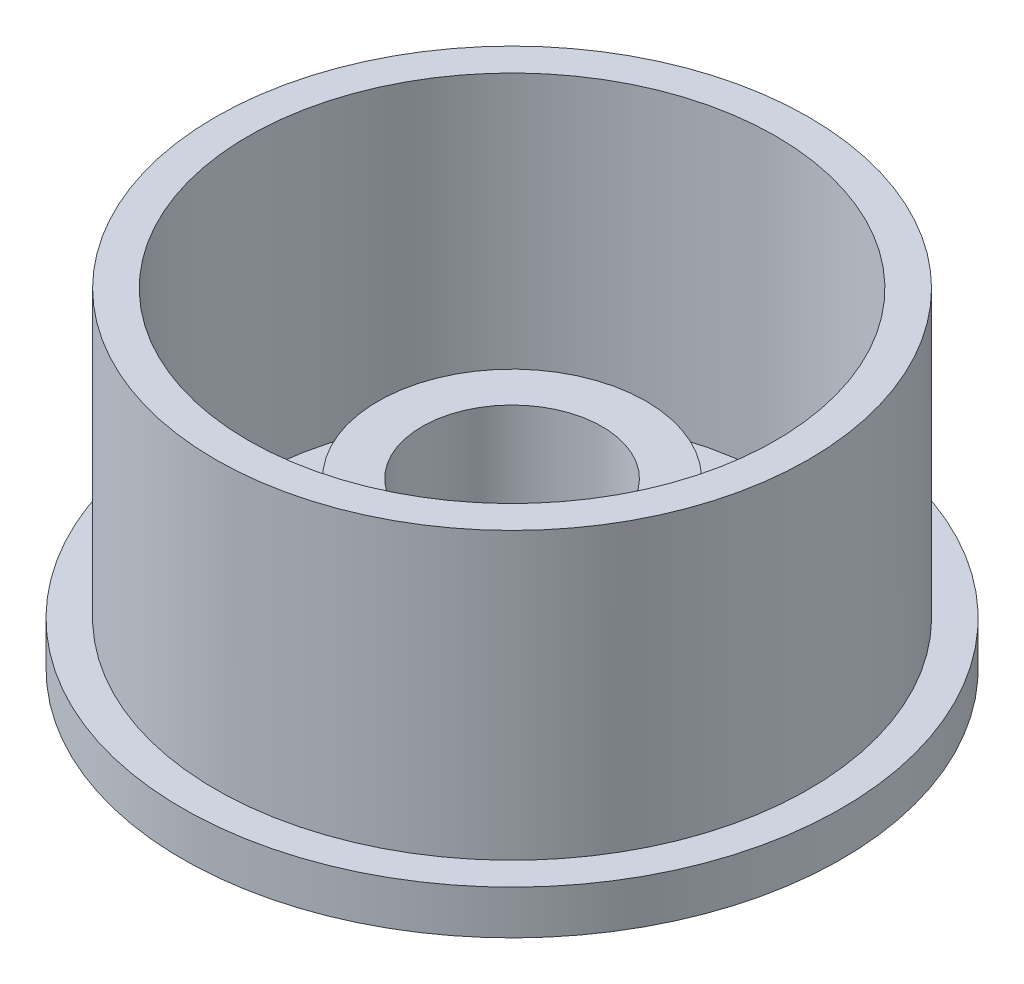
ISO-10303-21;
HEADER;
FILE_DESCRIPTION(('STEP AP214'),'2;1');
FILE_NAME('part.step','',(''),(''),'','','');
FILE_SCHEMA(('AUTOMOTIVE_DESIGN { 1 0 10303 214 1 1 1 1 }'));
ENDSEC;
DATA;
#1=APPLICATION_CONTEXT('core data for automotive mechanical design processes');
#2=APPLICATION_PROTOCOL_DEFINITION('international standard','automotive_design',2000,#1);
#3=PRODUCT_CONTEXT('',#1,'mechanical');
#4=PRODUCT('Part','Part','',(#3));
#5=PRODUCT_RELATED_PRODUCT_CATEGORY('part','',(#4));
#6=PRODUCT_DEFINITION_FORMATION('','',#4);
#7=PRODUCT_DEFINITION_CONTEXT('part definition',#1,'design');
#8=PRODUCT_DEFINITION('design','',#6,#7);
#9=PRODUCT_DEFINITION_SHAPE('','',#8);
#10=(LENGTH_UNIT() NAMED_UNIT(*) SI_UNIT(.MILLI.,.METRE.));
#11=(NAMED_UNIT(*) PLANE_ANGLE_UNIT() SI_UNIT($,.RADIAN.));
#12=(NAMED_UNIT(*) SI_UNIT($,.STERADIAN.) SOLID_ANGLE_UNIT());
#13=UNCERTAINTY_MEASURE_WITH_UNIT(LENGTH_MEASURE(1.E-05),#10,'distance_accuracy_value','');
#14=(GEOMETRIC_REPRESENTATION_CONTEXT(3) GLOBAL_UNCERTAINTY_ASSIGNED_CONTEXT((#13)) GLOBAL_UNIT_ASSIGNED_CONTEXT((#10,
#11,#12)) REPRESENTATION_CONTEXT('',''));
#15=CARTESIAN_POINT('',(0.,0.,0.));
#16=DIRECTION('',(0.,0.,1.));
#17=DIRECTION('',(1.,0.,0.));
#18=AXIS2_PLACEMENT_3D('',#15,#16,#17);
#19=CARTESIAN_POINT('',(0.,15.,0.));
#20=DIRECTION('',(0.,-1.,0.));
#21=DIRECTION('',(0.,0.,-1.));
#22=AXIS2_PLACEMENT_3D('',#19,#20,#21);
#23=CYLINDRICAL_SURFACE('',#22,13.5);
#24=CARTESIAN_POINT('',(0.,15.,0.));
#25=DIRECTION('',(0.,1.,0.));
#26=DIRECTION('',(0.,0.,1.));
#27=AXIS2_PLACEMENT_3D('',#24,#25,#26);
#28=CIRCLE('',#27,13.5);
#29=CARTESIAN_POINT('',(0.,15.,13.5));
#30=VERTEX_POINT('',#29);
#31=EDGE_CURVE('E45',#30,#30,#28,.T.);
#32=ORIENTED_EDGE('',*,*,#31,.F.);
#33=EDGE_LOOP('',(#32));
#34=FACE_BOUND('',#33,.T.);
#35=CARTESIAN_POINT('',(0.,2.,0.));
#36=DIRECTION('',(0.,-1.,0.));
#37=DIRECTION('',(0.,0.,-1.));
#38=AXIS2_PLACEMENT_3D('',#35,#36,#37);
#39=CIRCLE('',#38,13.5);
#40=CARTESIAN_POINT('',(0.,2.,-13.5));
#41=VERTEX_POINT('',#40);
#42=EDGE_CURVE('E11',#41,#41,#39,.T.);
#43=ORIENTED_EDGE('',*,*,#42,.F.);
#44=EDGE_LOOP('',(#43));
#45=FACE_BOUND('',#44,.T.);
#46=ADVANCED_FACE('F39',(#34,#45),#23,.T.);
#47=CARTESIAN_POINT('',(0.,1.5,0.));
#48=DIRECTION('',(0.,1.,0.));
#49=DIRECTION('',(0.,0.,1.));
#50=AXIS2_PLACEMENT_3D('',#47,#48,#49);
#51=PLANE('',#50);
#52=CARTESIAN_POINT('',(0.,1.5,0.));
#53=DIRECTION('',(0.,1.,0.));
#54=DIRECTION('',(0.,0.,1.));
#55=AXIS2_PLACEMENT_3D('',#52,#53,#54);
#56=CIRCLE('',#55,12.);
#57=CARTESIAN_POINT('',(0.,1.5,12.));
#58=VERTEX_POINT('',#57);
#59=EDGE_CURVE('E54',#58,#58,#56,.T.);
#60=ORIENTED_EDGE('',*,*,#59,.T.);
#61=EDGE_LOOP('',(#60));
#62=FACE_BOUND('',#61,.T.);
#63=CARTESIAN_POINT('',(0.,1.5,0.));
#64=DIRECTION('',(0.,1.,0.));
#65=DIRECTION('',(0.,0.,1.));
#66=AXIS2_PLACEMENT_3D('',#63,#64,#65);
#67=CIRCLE('',#66,6.1);
#68=CARTESIAN_POINT('',(0.,1.5,-6.1));
#69=VERTEX_POINT('',#68);
#70=EDGE_CURVE('E64',#69,#69,#67,.T.);
#71=ORIENTED_EDGE('',*,*,#70,.F.);
#72=EDGE_LOOP('',(#71));
#73=FACE_BOUND('',#72,.T.);
#74=ADVANCED_FACE('F101',(#62,#73),#51,.T.);
#75=CARTESIAN_POINT('',(0.,15.,0.));
#76=DIRECTION('',(0.,1.,0.));
#77=DIRECTION('',(0.,0.,1.));
#78=AXIS2_PLACEMENT_3D('',#75,#76,#77);
#79=PLANE('',#78);
#80=CARTESIAN_POINT('',(0.,15.,0.));
#81=DIRECTION('',(0.,1.,0.));
#82=DIRECTION('',(0.,0.,1.));
#83=AXIS2_PLACEMENT_3D('',#80,#81,#82);
#84=CIRCLE('',#83,12.);
#85=CARTESIAN_POINT('',(0.,15.,12.));
#86=VERTEX_POINT('',#85);
#87=EDGE_CURVE('E49',#86,#86,#84,.T.);
#88=ORIENTED_EDGE('',*,*,#87,.F.);
#89=EDGE_LOOP('',(#88));
#90=FACE_BOUND('',#89,.T.);
#91=ORIENTED_EDGE('',*,*,#31,.T.);
#92=EDGE_LOOP('',(#91));
#93=FACE_BOUND('',#92,.T.);
#94=ADVANCED_FACE('F106',(#90,#93),#79,.T.);
#95=CARTESIAN_POINT('',(0.,0.,0.));
#96=DIRECTION('',(0.,1.,0.));
#97=DIRECTION('',(0.,0.,1.));
#98=AXIS2_PLACEMENT_3D('',#95,#96,#97);
#99=PLANE('',#98);
#100=CARTESIAN_POINT('',(0.,0.,0.));
#101=DIRECTION('',(0.,1.,0.));
#102=DIRECTION('',(0.,0.,1.));
#103=AXIS2_PLACEMENT_3D('',#100,#101,#102);
#104=CIRCLE('',#103,4.1);
#105=CARTESIAN_POINT('',(0.,0.,4.1));
#106=VERTEX_POINT('',#105);
#107=EDGE_CURVE('E57',#106,#106,#104,.T.);
#108=ORIENTED_EDGE('',*,*,#107,.T.);
#109=EDGE_LOOP('',(#108));
#110=FACE_BOUND('',#109,.T.);
#111=CARTESIAN_POINT('',(0.,0.,0.));
#112=DIRECTION('',(0.,-1.,0.));
#113=DIRECTION('',(0.,0.,-1.));
#114=AXIS2_PLACEMENT_3D('',#111,#112,#113);
#115=CIRCLE('',#114,15.);
#116=CARTESIAN_POINT('',(0.,0.,-15.));
#117=VERTEX_POINT('',#116);
#118=EDGE_CURVE('E72',#117,#117,#115,.T.);
#119=ORIENTED_EDGE('',*,*,#118,.T.);
#120=EDGE_LOOP('',(#119));
#121=FACE_BOUND('',#120,.T.);
#122=ADVANCED_FACE('F85',(#110,#121),#99,.F.);
#123=CARTESIAN_POINT('',(0.,15.,0.));
#124=DIRECTION('',(0.,-1.,0.));
#125=DIRECTION('',(0.,0.,-1.));
#126=AXIS2_PLACEMENT_3D('',#123,#124,#125);
#127=CYLINDRICAL_SURFACE('',#126,12.);
#128=ORIENTED_EDGE('',*,*,#87,.T.);
#129=EDGE_LOOP('',(#128));
#130=FACE_BOUND('',#129,.T.);
#131=ORIENTED_EDGE('',*,*,#59,.F.);
#132=EDGE_LOOP('',(#131));
#133=FACE_BOUND('',#132,.T.);
#134=ADVANCED_FACE('F117',(#130,#133),#127,.F.);
#135=CARTESIAN_POINT('',(0.,-18.5,0.));
#136=DIRECTION('',(0.,1.,0.));
#137=DIRECTION('',(0.,0.,1.));
#138=AXIS2_PLACEMENT_3D('',#135,#136,#137);
#139=CYLINDRICAL_SURFACE('',#138,4.1);
#140=ORIENTED_EDGE('',*,*,#107,.F.);
#141=EDGE_LOOP('',(#140));
#142=FACE_BOUND('',#141,.T.);
#143=CARTESIAN_POINT('',(0.,7.5,0.));
#144=DIRECTION('',(0.,1.,0.));
#145=DIRECTION('',(0.,0.,1.));
#146=AXIS2_PLACEMENT_3D('',#143,#144,#145);
#147=CIRCLE('',#146,4.1);
#148=CARTESIAN_POINT('',(0.,7.5,4.1));
#149=VERTEX_POINT('',#148);
#150=EDGE_CURVE('E69',#149,#149,#147,.T.);
#151=ORIENTED_EDGE('',*,*,#150,.T.);
#152=EDGE_LOOP('',(#151));
#153=FACE_BOUND('',#152,.T.);
#154=ADVANCED_FACE('F123',(#142,#153),#139,.F.);
#155=CARTESIAN_POINT('',(0.,32.2534054609518,0.));
#156=DIRECTION('',(0.,-1.,0.));
#157=DIRECTION('',(0.,0.,-1.));
#158=AXIS2_PLACEMENT_3D('',#155,#156,#157);
#159=CYLINDRICAL_SURFACE('',#158,6.1);
#160=CARTESIAN_POINT('',(0.,7.5,0.));
#161=DIRECTION('',(0.,1.,0.));
#162=DIRECTION('',(0.,0.,1.));
#163=AXIS2_PLACEMENT_3D('',#160,#161,#162);
#164=CIRCLE('',#163,6.1);
#165=CARTESIAN_POINT('',(0.,7.5,-6.1));
#166=VERTEX_POINT('',#165);
#167=EDGE_CURVE('E59',#166,#166,#164,.T.);
#168=CARTESIAN_POINT('',(0.,1.5,-6.1));
#169=CARTESIAN_POINT('',(0.,1.5625,-6.1));
#170=CARTESIAN_POINT('',(0.,1.625,-6.1));
#171=CARTESIAN_POINT('',(0.,1.75,-6.1));
#172=CARTESIAN_POINT('',(0.,1.8125,-6.1));
#173=CARTESIAN_POINT('',(0.,1.9375,-6.1));
#174=CARTESIAN_POINT('',(0.,2.,-6.1));
#175=CARTESIAN_POINT('',(0.,2.125,-6.1));
#176=CARTESIAN_POINT('',(0.,2.1875,-6.1));
#177=CARTESIAN_POINT('',(0.,2.3125,-6.1));
#178=CARTESIAN_POINT('',(0.,2.375,-6.1));
#179=CARTESIAN_POINT('',(0.,2.5,-6.1));
#180=CARTESIAN_POINT('',(0.,2.5625,-6.1));
#181=CARTESIAN_POINT('',(0.,2.6875,-6.1));
#182=CARTESIAN_POINT('',(0.,2.75,-6.1));
#183=CARTESIAN_POINT('',(0.,2.875,-6.1));
#184=CARTESIAN_POINT('',(0.,2.9375,-6.1));
#185=CARTESIAN_POINT('',(0.,3.0625,-6.1));
#186=CARTESIAN_POINT('',(0.,3.125,-6.1));
#187=CARTESIAN_POINT('',(0.,3.25,-6.1));
#188=CARTESIAN_POINT('',(0.,3.3125,-6.1));
#189=CARTESIAN_POINT('',(0.,3.4375,-6.1));
#190=CARTESIAN_POINT('',(0.,3.5,-6.1));
#191=CARTESIAN_POINT('',(0.,3.625,-6.1));
#192=CARTESIAN_POINT('',(0.,3.6875,-6.1));
#193=CARTESIAN_POINT('',(0.,3.8125,-6.1));
#194=CARTESIAN_POINT('',(0.,3.875,-6.1));
#195=CARTESIAN_POINT('',(0.,4.,-6.1));
#196=CARTESIAN_POINT('',(0.,4.0625,-6.1));
#197=CARTESIAN_POINT('',(0.,4.1875,-6.1));
#198=CARTESIAN_POINT('',(0.,4.25,-6.1));
#199=CARTESIAN_POINT('',(0.,4.375,-6.1));
#200=CARTESIAN_POINT('',(0.,4.4375,-6.1));
#201=CARTESIAN_POINT('',(0.,4.5625,-6.1));
#202=CARTESIAN_POINT('',(0.,4.625,-6.1));
#203=CARTESIAN_POINT('',(0.,4.75,-6.1));
#204=CARTESIAN_POINT('',(0.,4.8125,-6.1));
#205=CARTESIAN_POINT('',(0.,4.9375,-6.1));
#206=CARTESIAN_POINT('',(0.,5.,-6.1));
#207=CARTESIAN_POINT('',(0.,5.125,-6.1));
#208=CARTESIAN_POINT('',(0.,5.1875,-6.1));
#209=CARTESIAN_POINT('',(0.,5.3125,-6.1));
#210=CARTESIAN_POINT('',(0.,5.375,-6.1));
#211=CARTESIAN_POINT('',(0.,5.5,-6.1));
#212=CARTESIAN_POINT('',(0.,5.5625,-6.1));
#213=CARTESIAN_POINT('',(0.,5.68749999999999,-6.1));
#214=CARTESIAN_POINT('',(0.,5.74999999999999,-6.1));
#215=CARTESIAN_POINT('',(0.,5.87499999999999,-6.1));
#216=CARTESIAN_POINT('',(0.,5.93749999999999,-6.1));
#217=CARTESIAN_POINT('',(0.,6.06249999999999,-6.1));
#218=CARTESIAN_POINT('',(0.,6.12499999999999,-6.1));
#219=CARTESIAN_POINT('',(0.,6.25,-6.1));
#220=CARTESIAN_POINT('',(0.,6.3125,-6.1));
#221=CARTESIAN_POINT('',(0.,6.4375,-6.1));
#222=CARTESIAN_POINT('',(0.,6.5,-6.1));
#223=CARTESIAN_POINT('',(0.,6.625,-6.1));
#224=CARTESIAN_POINT('',(0.,6.6875,-6.1));
#225=CARTESIAN_POINT('',(0.,6.8125,-6.1));
#226=CARTESIAN_POINT('',(0.,6.875,-6.1));
#227=CARTESIAN_POINT('',(0.,7.,-6.1));
#228=CARTESIAN_POINT('',(0.,7.0625,-6.1));
#229=CARTESIAN_POINT('',(0.,7.1875,-6.1));
#230=CARTESIAN_POINT('',(0.,7.25,-6.1));
#231=CARTESIAN_POINT('',(0.,7.375,-6.1));
#232=CARTESIAN_POINT('',(0.,7.4375,-6.1));
#233=CARTESIAN_POINT('',(0.,7.5,-6.1));
#234=B_SPLINE_CURVE_WITH_KNOTS('',3,(#168,#169,#170,#171,#172,#173,#174,#175,#176,#177,#178,
#179,#180,#181,#182,#183,#184,#185,#186,#187,#188,#189,#190,#191,#192,#193,#194,#195,#196,#197,
#198,#199,#200,#201,#202,#203,#204,#205,#206,#207,#208,#209,#210,#211,#212,#213,#214,#215,#216,
#217,#218,#219,#220,#221,#222,#223,#224,#225,#226,#227,#228,#229,#230,#231,#232,#233),
.UNSPECIFIED.,.F.,.F.,(4,2,2,2,2,2,2,2,2,2,2,2,2,2,2,2,2,2,2,2,2,2,2,2,2,2,2,2,2,2,2,2,4),(0.,
0.1875,0.375,0.5625,0.750000000000001,0.937500000000001,1.125,1.3125,1.5,1.6875,1.875,2.0625,
2.25,2.4375,2.625,2.8125,3.,3.1875,3.375,3.5625,3.75,3.9375,4.125,4.3125,4.5,4.6875,4.875,
5.0625,5.25,5.4375,5.625,5.8125,6.),.UNSPECIFIED.);
#235=EDGE_CURVE('BSEAM97',#69,#166,#234,.T.);
#236=ORIENTED_EDGE('',*,*,#70,.T.);
#237=ORIENTED_EDGE('',*,*,#167,.F.);
#238=ORIENTED_EDGE('',*,*,#235,.T.);
#239=ORIENTED_EDGE('',*,*,#235,.F.);
#240=EDGE_LOOP('',(#236,#238,#237,#239));
#241=FACE_BOUND('',#240,.T.);
#242=ADVANCED_FACE('F97',(#241),#159,.T.);
#243=CARTESIAN_POINT('',(0.,7.5,0.));
#244=DIRECTION('',(0.,1.,0.));
#245=DIRECTION('',(0.,0.,1.));
#246=AXIS2_PLACEMENT_3D('',#243,#244,#245);
#247=PLANE('',#246);
#248=ORIENTED_EDGE('',*,*,#150,.F.);
#249=EDGE_LOOP('',(#248));
#250=FACE_BOUND('',#249,.T.);
#251=ORIENTED_EDGE('',*,*,#167,.T.);
#252=EDGE_LOOP('',(#251));
#253=FACE_BOUND('',#252,.T.);
#254=ADVANCED_FACE('F90',(#250,#253),#247,.T.);
#255=CARTESIAN_POINT('',(0.,2.,0.));
#256=DIRECTION('',(0.,-1.,0.));
#257=DIRECTION('',(0.,0.,-1.));
#258=AXIS2_PLACEMENT_3D('',#255,#256,#257);
#259=CYLINDRICAL_SURFACE('',#258,15.);
#260=CARTESIAN_POINT('',(0.,2.,0.));
#261=DIRECTION('',(0.,-1.,0.));
#262=DIRECTION('',(0.,0.,-1.));
#263=AXIS2_PLACEMENT_3D('',#260,#261,#262);
#264=CIRCLE('',#263,15.);
#265=CARTESIAN_POINT('',(0.,2.,-15.));
#266=VERTEX_POINT('',#265);
#267=EDGE_CURVE('E76',#266,#266,#264,.T.);
#268=ORIENTED_EDGE('',*,*,#267,.T.);
#269=EDGE_LOOP('',(#268));
#270=FACE_BOUND('',#269,.T.);
#271=ORIENTED_EDGE('',*,*,#118,.F.);
#272=EDGE_LOOP('',(#271));
#273=FACE_BOUND('',#272,.T.);
#274=ADVANCED_FACE('F87',(#270,#273),#259,.T.);
#275=CARTESIAN_POINT('',(0.,2.,0.));
#276=DIRECTION('',(0.,-1.,0.));
#277=DIRECTION('',(0.,0.,-1.));
#278=AXIS2_PLACEMENT_3D('',#275,#276,#277);
#279=PLANE('',#278);
#280=ORIENTED_EDGE('',*,*,#42,.T.);
#281=EDGE_LOOP('',(#280));
#282=FACE_BOUND('',#281,.T.);
#283=ORIENTED_EDGE('',*,*,#267,.F.);
#284=EDGE_LOOP('',(#283));
#285=FACE_BOUND('',#284,.T.);
#286=ADVANCED_FACE('F89',(#282,#285),#279,.F.);
#287=CLOSED_SHELL('',(#46,#74,#94,#122,#134,#154,#242,#254,#274,#286));
#288=MANIFOLD_SOLID_BREP('B2',#287);
#289=ADVANCED_BREP_SHAPE_REPRESENTATION('',(#18,#288),#14);
#290=SHAPE_DEFINITION_REPRESENTATION(#9,#289);
ENDSEC;
END-ISO-10303-21;
